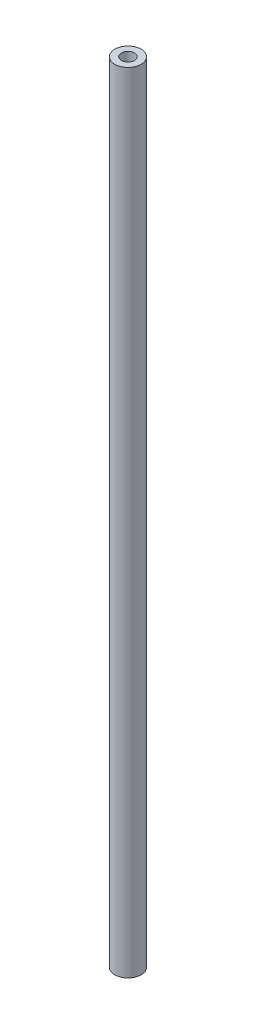
ISO-10303-21;
HEADER;
FILE_DESCRIPTION(('STEP AP214'),'2;1');
FILE_NAME('part.step','',(''),(''),'','','');
FILE_SCHEMA(('AUTOMOTIVE_DESIGN { 1 0 10303 214 1 1 1 1 }'));
ENDSEC;
DATA;
#1=APPLICATION_CONTEXT('core data for automotive mechanical design processes');
#2=APPLICATION_PROTOCOL_DEFINITION('international standard','automotive_design',2000,#1);
#3=PRODUCT_CONTEXT('',#1,'mechanical');
#4=PRODUCT('Part','Part','',(#3));
#5=PRODUCT_RELATED_PRODUCT_CATEGORY('part','',(#4));
#6=PRODUCT_DEFINITION_FORMATION('','',#4);
#7=PRODUCT_DEFINITION_CONTEXT('part definition',#1,'design');
#8=PRODUCT_DEFINITION('design','',#6,#7);
#9=PRODUCT_DEFINITION_SHAPE('','',#8);
#10=(LENGTH_UNIT() NAMED_UNIT(*) SI_UNIT(.MILLI.,.METRE.));
#11=(NAMED_UNIT(*) PLANE_ANGLE_UNIT() SI_UNIT($,.RADIAN.));
#12=(NAMED_UNIT(*) SI_UNIT($,.STERADIAN.) SOLID_ANGLE_UNIT());
#13=UNCERTAINTY_MEASURE_WITH_UNIT(LENGTH_MEASURE(1.E-05),#10,'distance_accuracy_value','');
#14=(GEOMETRIC_REPRESENTATION_CONTEXT(3) GLOBAL_UNCERTAINTY_ASSIGNED_CONTEXT((#13)) GLOBAL_UNIT_ASSIGNED_CONTEXT((#10,
#11,#12)) REPRESENTATION_CONTEXT('',''));
#15=CARTESIAN_POINT('',(0.,0.,0.));
#16=DIRECTION('',(0.,0.,1.));
#17=DIRECTION('',(1.,0.,0.));
#18=AXIS2_PLACEMENT_3D('',#15,#16,#17);
#19=CARTESIAN_POINT('',(0.,381.,0.));
#20=DIRECTION('',(0.,1.,0.));
#21=DIRECTION('',(0.,0.,1.));
#22=AXIS2_PLACEMENT_3D('',#19,#20,#21);
#23=PLANE('',#22);
#24=CARTESIAN_POINT('',(0.,381.,0.));
#25=DIRECTION('',(0.,1.,0.));
#26=DIRECTION('',(0.,0.,1.));
#27=AXIS2_PLACEMENT_3D('',#24,#25,#26);
#28=CIRCLE('',#27,6.35);
#29=CARTESIAN_POINT('',(0.,381.,6.35));
#30=VERTEX_POINT('',#29);
#31=EDGE_CURVE('E10',#30,#30,#28,.T.);
#32=ORIENTED_EDGE('',*,*,#31,.T.);
#33=EDGE_LOOP('',(#32));
#34=FACE_BOUND('',#33,.T.);
#35=CARTESIAN_POINT('',(0.,381.,0.));
#36=DIRECTION('',(0.,1.,0.));
#37=DIRECTION('',(0.,0.,1.));
#38=AXIS2_PLACEMENT_3D('',#35,#36,#37);
#39=CIRCLE('',#38,3.175);
#40=CARTESIAN_POINT('',(0.,381.,3.175));
#41=VERTEX_POINT('',#40);
#42=EDGE_CURVE('E42',#41,#41,#39,.T.);
#43=ORIENTED_EDGE('',*,*,#42,.F.);
#44=EDGE_LOOP('',(#43));
#45=FACE_BOUND('',#44,.T.);
#46=ADVANCED_FACE('F31',(#34,#45),#23,.T.);
#47=CARTESIAN_POINT('',(0.,0.,0.));
#48=DIRECTION('',(0.,1.,0.));
#49=DIRECTION('',(0.,0.,1.));
#50=AXIS2_PLACEMENT_3D('',#47,#48,#49);
#51=PLANE('',#50);
#52=CARTESIAN_POINT('',(0.,0.,0.));
#53=DIRECTION('',(0.,1.,0.));
#54=DIRECTION('',(0.,0.,1.));
#55=AXIS2_PLACEMENT_3D('',#52,#53,#54);
#56=CIRCLE('',#55,6.35);
#57=CARTESIAN_POINT('',(0.,0.,6.35));
#58=VERTEX_POINT('',#57);
#59=EDGE_CURVE('E35',#58,#58,#56,.T.);
#60=ORIENTED_EDGE('',*,*,#59,.F.);
#61=EDGE_LOOP('',(#60));
#62=FACE_BOUND('',#61,.T.);
#63=CARTESIAN_POINT('',(0.,0.,0.));
#64=DIRECTION('',(0.,1.,0.));
#65=DIRECTION('',(0.,0.,1.));
#66=AXIS2_PLACEMENT_3D('',#63,#64,#65);
#67=CIRCLE('',#66,3.175);
#68=CARTESIAN_POINT('',(0.,0.,3.175));
#69=VERTEX_POINT('',#68);
#70=EDGE_CURVE('E44',#69,#69,#67,.T.);
#71=ORIENTED_EDGE('',*,*,#70,.T.);
#72=EDGE_LOOP('',(#71));
#73=FACE_BOUND('',#72,.T.);
#74=ADVANCED_FACE('F54',(#62,#73),#51,.F.);
#75=CARTESIAN_POINT('',(0.,381.,0.));
#76=DIRECTION('',(0.,-1.,0.));
#77=DIRECTION('',(0.,0.,-1.));
#78=AXIS2_PLACEMENT_3D('',#75,#76,#77);
#79=CYLINDRICAL_SURFACE('',#78,6.35);
#80=ORIENTED_EDGE('',*,*,#31,.F.);
#81=EDGE_LOOP('',(#80));
#82=FACE_BOUND('',#81,.T.);
#83=ORIENTED_EDGE('',*,*,#59,.T.);
#84=EDGE_LOOP('',(#83));
#85=FACE_BOUND('',#84,.T.);
#86=ADVANCED_FACE('F33',(#82,#85),#79,.T.);
#87=CARTESIAN_POINT('',(0.,381.,0.));
#88=DIRECTION('',(0.,-1.,0.));
#89=DIRECTION('',(0.,0.,-1.));
#90=AXIS2_PLACEMENT_3D('',#87,#88,#89);
#91=CYLINDRICAL_SURFACE('',#90,3.175);
#92=ORIENTED_EDGE('',*,*,#42,.T.);
#93=EDGE_LOOP('',(#92));
#94=FACE_BOUND('',#93,.T.);
#95=ORIENTED_EDGE('',*,*,#70,.F.);
#96=EDGE_LOOP('',(#95));
#97=FACE_BOUND('',#96,.T.);
#98=ADVANCED_FACE('F50',(#94,#97),#91,.F.);
#99=CLOSED_SHELL('',(#46,#74,#86,#98));
#100=MANIFOLD_SOLID_BREP('B2',#99);
#101=ADVANCED_BREP_SHAPE_REPRESENTATION('',(#18,#100),#14);
#102=SHAPE_DEFINITION_REPRESENTATION(#9,#101);
ENDSEC;
END-ISO-10303-21;
